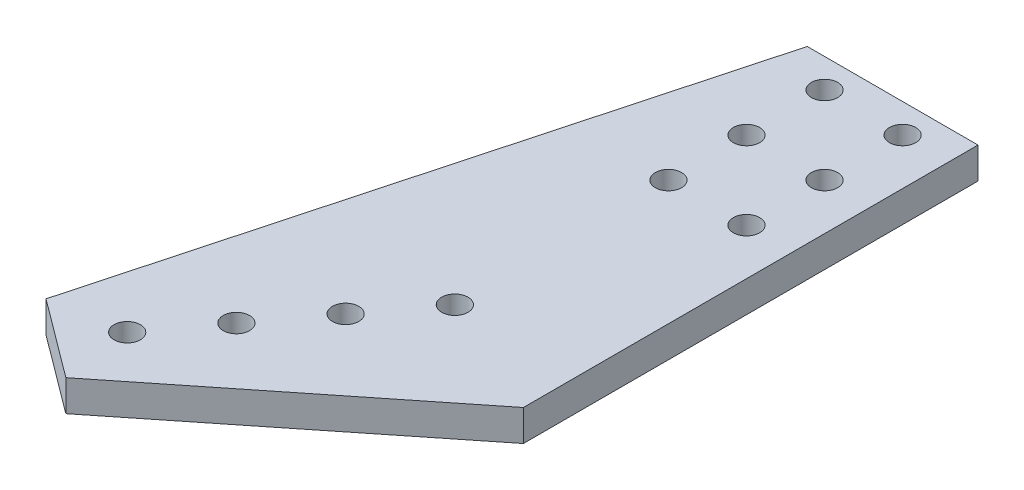
ISO-10303-21;
HEADER;
FILE_DESCRIPTION(('STEP AP214'),'2;1');
FILE_NAME('part.step','',(''),(''),'','','');
FILE_SCHEMA(('AUTOMOTIVE_DESIGN { 1 0 10303 214 1 1 1 1 }'));
ENDSEC;
DATA;
#1=APPLICATION_CONTEXT('core data for automotive mechanical design processes');
#2=APPLICATION_PROTOCOL_DEFINITION('international standard','automotive_design',2000,#1);
#3=PRODUCT_CONTEXT('',#1,'mechanical');
#4=PRODUCT('Part','Part','',(#3));
#5=PRODUCT_RELATED_PRODUCT_CATEGORY('part','',(#4));
#6=PRODUCT_DEFINITION_FORMATION('','',#4);
#7=PRODUCT_DEFINITION_CONTEXT('part definition',#1,'design');
#8=PRODUCT_DEFINITION('design','',#6,#7);
#9=PRODUCT_DEFINITION_SHAPE('','',#8);
#10=(LENGTH_UNIT() NAMED_UNIT(*) SI_UNIT(.MILLI.,.METRE.));
#11=(NAMED_UNIT(*) PLANE_ANGLE_UNIT() SI_UNIT($,.RADIAN.));
#12=(NAMED_UNIT(*) SI_UNIT($,.STERADIAN.) SOLID_ANGLE_UNIT());
#13=UNCERTAINTY_MEASURE_WITH_UNIT(LENGTH_MEASURE(1.E-05),#10,'distance_accuracy_value','');
#14=(GEOMETRIC_REPRESENTATION_CONTEXT(3) GLOBAL_UNCERTAINTY_ASSIGNED_CONTEXT((#13)) GLOBAL_UNIT_ASSIGNED_CONTEXT((#10,
#11,#12)) REPRESENTATION_CONTEXT('',''));
#15=CARTESIAN_POINT('',(0.,0.,0.));
#16=DIRECTION('',(0.,0.,1.));
#17=DIRECTION('',(1.,0.,0.));
#18=AXIS2_PLACEMENT_3D('',#15,#16,#17);
#19=CARTESIAN_POINT('',(-80.153631820855,32.,-59.7946093383578));
#20=DIRECTION('',(0.597946093383578,0.,-0.80153631820855));
#21=DIRECTION('',(-0.80153631820855,0.,-0.597946093383578));
#22=AXIS2_PLACEMENT_3D('',#19,#20,#21);
#23=PLANE('',#22);
#24=DIRECTION('',(0.80153631820855,0.,0.597946093383578));
#25=VECTOR('',#24,1.);
#26=CARTESIAN_POINT('',(-80.153631820855,0.,-59.7946093383578));
#27=LINE('',#26,#25);
#28=CARTESIAN_POINT('',(-80.153631820855,0.,-59.7946093383578));
#29=VERTEX_POINT('',#28);
#30=CARTESIAN_POINT('',(0.,0.,0.));
#31=VERTEX_POINT('',#30);
#32=EDGE_CURVE('E108',#29,#31,#27,.T.);
#33=ORIENTED_EDGE('',*,*,#32,.T.);
#34=DIRECTION('',(0.,-1.,0.));
#35=VECTOR('',#34,1.);
#36=CARTESIAN_POINT('',(0.,32.,0.));
#37=LINE('',#36,#35);
#38=CARTESIAN_POINT('',(0.,32.,0.));
#39=VERTEX_POINT('',#38);
#40=EDGE_CURVE('E11',#39,#31,#37,.T.);
#41=ORIENTED_EDGE('',*,*,#40,.F.);
#42=DIRECTION('',(0.80153631820855,0.,0.597946093383578));
#43=VECTOR('',#42,1.);
#44=CARTESIAN_POINT('',(-80.153631820855,32.,-59.7946093383578));
#45=LINE('',#44,#43);
#46=CARTESIAN_POINT('',(-80.153631820855,32.,-59.7946093383578));
#47=VERTEX_POINT('',#46);
#48=EDGE_CURVE('E117',#47,#39,#45,.T.);
#49=ORIENTED_EDGE('',*,*,#48,.F.);
#50=DIRECTION('',(0.,-1.,0.));
#51=VECTOR('',#50,1.);
#52=CARTESIAN_POINT('',(-80.153631820855,32.,-59.7946093383578));
#53=LINE('',#52,#51);
#54=EDGE_CURVE('E104',#47,#29,#53,.T.);
#55=ORIENTED_EDGE('',*,*,#54,.T.);
#56=EDGE_LOOP('',(#33,#41,#49,#55));
#57=FACE_BOUND('',#56,.T.);
#58=ADVANCED_FACE('F34',(#57),#23,.F.);
#59=CARTESIAN_POINT('',(261.,32.,-208.));
#60=DIRECTION('',(-0.623232338922246,0.,-0.782036732974549));
#61=DIRECTION('',(-0.782036732974549,0.,0.623232338922246));
#62=AXIS2_PLACEMENT_3D('',#59,#60,#61);
#63=PLANE('',#62);
#64=DIRECTION('',(0.782036732974549,0.,-0.623232338922246));
#65=VECTOR('',#64,1.);
#66=CARTESIAN_POINT('',(261.,0.,-208.));
#67=LINE('',#66,#65);
#68=CARTESIAN_POINT('',(261.,0.,-208.));
#69=VERTEX_POINT('',#68);
#70=EDGE_CURVE('E111',#31,#69,#67,.T.);
#71=ORIENTED_EDGE('',*,*,#70,.T.);
#72=DIRECTION('',(0.,-1.,0.));
#73=VECTOR('',#72,1.);
#74=CARTESIAN_POINT('',(261.,32.,-208.));
#75=LINE('',#74,#73);
#76=CARTESIAN_POINT('',(261.,32.,-208.));
#77=VERTEX_POINT('',#76);
#78=EDGE_CURVE('E42',#77,#69,#75,.T.);
#79=ORIENTED_EDGE('',*,*,#78,.F.);
#80=DIRECTION('',(0.782036732974549,0.,-0.623232338922246));
#81=VECTOR('',#80,1.);
#82=CARTESIAN_POINT('',(261.,32.,-208.));
#83=LINE('',#82,#81);
#84=EDGE_CURVE('E84',#39,#77,#83,.T.);
#85=ORIENTED_EDGE('',*,*,#84,.F.);
#86=ORIENTED_EDGE('',*,*,#40,.T.);
#87=EDGE_LOOP('',(#71,#79,#85,#86));
#88=FACE_BOUND('',#87,.T.);
#89=ADVANCED_FACE('F137',(#88),#63,.F.);
#90=CARTESIAN_POINT('',(261.,32.,-674.));
#91=DIRECTION('',(-1.,0.,0.));
#92=DIRECTION('',(0.,0.,1.));
#93=AXIS2_PLACEMENT_3D('',#90,#91,#92);
#94=PLANE('',#93);
#95=DIRECTION('',(0.,0.,-1.));
#96=VECTOR('',#95,1.);
#97=CARTESIAN_POINT('',(261.,0.,-674.));
#98=LINE('',#97,#96);
#99=CARTESIAN_POINT('',(261.,0.,-674.));
#100=VERTEX_POINT('',#99);
#101=EDGE_CURVE('E99',#69,#100,#98,.T.);
#102=ORIENTED_EDGE('',*,*,#101,.T.);
#103=DIRECTION('',(0.,-1.,0.));
#104=VECTOR('',#103,1.);
#105=CARTESIAN_POINT('',(261.,32.,-674.));
#106=LINE('',#105,#104);
#107=CARTESIAN_POINT('',(261.,32.,-674.));
#108=VERTEX_POINT('',#107);
#109=EDGE_CURVE('E96',#108,#100,#106,.T.);
#110=ORIENTED_EDGE('',*,*,#109,.F.);
#111=DIRECTION('',(0.,0.,-1.));
#112=VECTOR('',#111,1.);
#113=CARTESIAN_POINT('',(261.,32.,-674.));
#114=LINE('',#113,#112);
#115=EDGE_CURVE('E88',#77,#108,#114,.T.);
#116=ORIENTED_EDGE('',*,*,#115,.F.);
#117=ORIENTED_EDGE('',*,*,#78,.T.);
#118=EDGE_LOOP('',(#102,#110,#116,#117));
#119=FACE_BOUND('',#118,.T.);
#120=ADVANCED_FACE('F97',(#119),#94,.F.);
#121=CARTESIAN_POINT('',(85.9999999999999,32.,-674.));
#122=DIRECTION('',(0.,0.,1.));
#123=DIRECTION('',(1.,0.,0.));
#124=AXIS2_PLACEMENT_3D('',#121,#122,#123);
#125=PLANE('',#124);
#126=DIRECTION('',(-1.,0.,0.));
#127=VECTOR('',#126,1.);
#128=CARTESIAN_POINT('',(85.9999999999999,0.,-674.));
#129=LINE('',#128,#127);
#130=CARTESIAN_POINT('',(85.9999999999999,0.,-674.));
#131=VERTEX_POINT('',#130);
#132=EDGE_CURVE('E70',#100,#131,#129,.T.);
#133=ORIENTED_EDGE('',*,*,#132,.T.);
#134=DIRECTION('',(0.,-1.,0.));
#135=VECTOR('',#134,1.);
#136=CARTESIAN_POINT('',(85.9999999999999,32.,-674.));
#137=LINE('',#136,#135);
#138=CARTESIAN_POINT('',(85.9999999999999,32.,-674.));
#139=VERTEX_POINT('',#138);
#140=EDGE_CURVE('E100',#139,#131,#137,.T.);
#141=ORIENTED_EDGE('',*,*,#140,.F.);
#142=DIRECTION('',(-1.,0.,0.));
#143=VECTOR('',#142,1.);
#144=CARTESIAN_POINT('',(85.9999999999999,32.,-674.));
#145=LINE('',#144,#143);
#146=EDGE_CURVE('E92',#108,#139,#145,.T.);
#147=ORIENTED_EDGE('',*,*,#146,.F.);
#148=ORIENTED_EDGE('',*,*,#109,.T.);
#149=EDGE_LOOP('',(#133,#141,#147,#148));
#150=FACE_BOUND('',#149,.T.);
#151=ADVANCED_FACE('F102',(#150),#125,.F.);
#152=CARTESIAN_POINT('',(-80.153631820855,32.,-59.7946093383578));
#153=DIRECTION('',(0.965303128958091,0.,0.261131900049992));
#154=DIRECTION('',(0.261131900049992,0.,-0.965303128958091));
#155=AXIS2_PLACEMENT_3D('',#152,#153,#154);
#156=PLANE('',#155);
#157=DIRECTION('',(-0.261131900049991,0.,0.965303128958091));
#158=VECTOR('',#157,1.);
#159=CARTESIAN_POINT('',(-80.153631820855,0.,-59.7946093383578));
#160=LINE('',#159,#158);
#161=EDGE_CURVE('E76',#131,#29,#160,.T.);
#162=ORIENTED_EDGE('',*,*,#161,.T.);
#163=ORIENTED_EDGE('',*,*,#54,.F.);
#164=DIRECTION('',(-0.261131900049991,0.,0.965303128958091));
#165=VECTOR('',#164,1.);
#166=CARTESIAN_POINT('',(-80.153631820855,32.,-59.7946093383578));
#167=LINE('',#166,#165);
#168=EDGE_CURVE('E50',#139,#47,#167,.T.);
#169=ORIENTED_EDGE('',*,*,#168,.F.);
#170=ORIENTED_EDGE('',*,*,#140,.T.);
#171=EDGE_LOOP('',(#162,#163,#169,#170));
#172=FACE_BOUND('',#171,.T.);
#173=ADVANCED_FACE('F125',(#172),#156,.F.);
#174=CARTESIAN_POINT('',(0.,32.,0.));
#175=DIRECTION('',(0.,-1.,0.));
#176=DIRECTION('',(0.,0.,-1.));
#177=AXIS2_PLACEMENT_3D('',#174,#175,#176);
#178=PLANE('',#177);
#179=CARTESIAN_POINT('',(38.9621289886949,32.,-135.847632952185));
#180=DIRECTION('',(0.,1.,0.));
#181=DIRECTION('',(0.,0.,1.));
#182=AXIS2_PLACEMENT_3D('',#179,#180,#181);
#183=CIRCLE('',#182,13.5);
#184=CARTESIAN_POINT('',(38.9621289886949,32.,-122.347632952185));
#185=VERTEX_POINT('',#184);
#186=EDGE_CURVE('E279',#185,#185,#183,.T.);
#187=ORIENTED_EDGE('',*,*,#186,.F.);
#188=EDGE_LOOP('',(#187));
#189=FACE_BOUND('',#188,.T.);
#190=CARTESIAN_POINT('',(86.7978164593811,32.,-199.970538408869));
#191=DIRECTION('',(0.,1.,0.));
#192=DIRECTION('',(0.,0.,1.));
#193=AXIS2_PLACEMENT_3D('',#190,#191,#192);
#194=CIRCLE('',#193,13.5);
#195=CARTESIAN_POINT('',(86.7978164593811,32.,-186.470538408869));
#196=VERTEX_POINT('',#195);
#197=EDGE_CURVE('E281',#196,#196,#194,.T.);
#198=ORIENTED_EDGE('',*,*,#197,.F.);
#199=EDGE_LOOP('',(#198));
#200=FACE_BOUND('',#199,.T.);
#201=CARTESIAN_POINT('',(-8.87355848199136,32.,-71.7247274955008));
#202=DIRECTION('',(0.,1.,0.));
#203=DIRECTION('',(0.,0.,1.));
#204=AXIS2_PLACEMENT_3D('',#201,#202,#203);
#205=CIRCLE('',#204,13.5);
#206=CARTESIAN_POINT('',(-8.87355848199136,32.,-58.2247274955008));
#207=VERTEX_POINT('',#206);
#208=EDGE_CURVE('E287',#207,#207,#205,.T.);
#209=ORIENTED_EDGE('',*,*,#208,.F.);
#210=EDGE_LOOP('',(#209));
#211=FACE_BOUND('',#210,.T.);
#212=CARTESIAN_POINT('',(134.633503930067,32.,-264.093443865553));
#213=DIRECTION('',(0.,1.,0.));
#214=DIRECTION('',(0.,0.,1.));
#215=AXIS2_PLACEMENT_3D('',#212,#213,#214);
#216=CIRCLE('',#215,13.5);
#217=CARTESIAN_POINT('',(134.633503930067,32.,-250.593443865553));
#218=VERTEX_POINT('',#217);
#219=EDGE_CURVE('E293',#218,#218,#216,.T.);
#220=ORIENTED_EDGE('',*,*,#219,.F.);
#221=EDGE_LOOP('',(#220));
#222=FACE_BOUND('',#221,.T.);
#223=CARTESIAN_POINT('',(213.5,32.,-484.193304549108));
#224=DIRECTION('',(0.,1.,0.));
#225=DIRECTION('',(0.,0.,1.));
#226=AXIS2_PLACEMENT_3D('',#223,#224,#225);
#227=CIRCLE('',#226,13.5);
#228=CARTESIAN_POINT('',(213.5,32.,-470.693304549108));
#229=VERTEX_POINT('',#228);
#230=EDGE_CURVE('E299',#229,#229,#227,.T.);
#231=ORIENTED_EDGE('',*,*,#230,.F.);
#232=EDGE_LOOP('',(#231));
#233=FACE_BOUND('',#232,.T.);
#234=CARTESIAN_POINT('',(133.5,32.,-484.193304549108));
#235=DIRECTION('',(0.,1.,0.));
#236=DIRECTION('',(0.,0.,1.));
#237=AXIS2_PLACEMENT_3D('',#234,#235,#236);
#238=CIRCLE('',#237,13.5);
#239=CARTESIAN_POINT('',(133.5,32.,-470.693304549108));
#240=VERTEX_POINT('',#239);
#241=EDGE_CURVE('E305',#240,#240,#238,.T.);
#242=ORIENTED_EDGE('',*,*,#241,.F.);
#243=EDGE_LOOP('',(#242));
#244=FACE_BOUND('',#243,.T.);
#245=CARTESIAN_POINT('',(213.5,32.,-564.193304549108));
#246=DIRECTION('',(0.,1.,0.));
#247=DIRECTION('',(0.,0.,1.));
#248=AXIS2_PLACEMENT_3D('',#245,#246,#247);
#249=CIRCLE('',#248,13.5);
#250=CARTESIAN_POINT('',(213.5,32.,-550.693304549108));
#251=VERTEX_POINT('',#250);
#252=EDGE_CURVE('E311',#251,#251,#249,.T.);
#253=ORIENTED_EDGE('',*,*,#252,.F.);
#254=EDGE_LOOP('',(#253));
#255=FACE_BOUND('',#254,.T.);
#256=CARTESIAN_POINT('',(133.5,32.,-564.193304549108));
#257=DIRECTION('',(0.,1.,0.));
#258=DIRECTION('',(0.,0.,1.));
#259=AXIS2_PLACEMENT_3D('',#256,#257,#258);
#260=CIRCLE('',#259,13.5);
#261=CARTESIAN_POINT('',(133.5,32.,-550.693304549108));
#262=VERTEX_POINT('',#261);
#263=EDGE_CURVE('E317',#262,#262,#260,.T.);
#264=ORIENTED_EDGE('',*,*,#263,.F.);
#265=EDGE_LOOP('',(#264));
#266=FACE_BOUND('',#265,.T.);
#267=CARTESIAN_POINT('',(213.5,32.,-644.193304549108));
#268=DIRECTION('',(0.,1.,0.));
#269=DIRECTION('',(0.,0.,1.));
#270=AXIS2_PLACEMENT_3D('',#267,#268,#269);
#271=CIRCLE('',#270,13.5);
#272=CARTESIAN_POINT('',(213.5,32.,-630.693304549108));
#273=VERTEX_POINT('',#272);
#274=EDGE_CURVE('E323',#273,#273,#271,.T.);
#275=ORIENTED_EDGE('',*,*,#274,.F.);
#276=EDGE_LOOP('',(#275));
#277=FACE_BOUND('',#276,.T.);
#278=CARTESIAN_POINT('',(133.5,32.,-644.193304549108));
#279=DIRECTION('',(0.,1.,0.));
#280=DIRECTION('',(0.,0.,1.));
#281=AXIS2_PLACEMENT_3D('',#278,#279,#280);
#282=CIRCLE('',#281,13.5);
#283=CARTESIAN_POINT('',(133.5,32.,-630.693304549108));
#284=VERTEX_POINT('',#283);
#285=EDGE_CURVE('E329',#284,#284,#282,.T.);
#286=ORIENTED_EDGE('',*,*,#285,.F.);
#287=EDGE_LOOP('',(#286));
#288=FACE_BOUND('',#287,.T.);
#289=ORIENTED_EDGE('',*,*,#48,.T.);
#290=ORIENTED_EDGE('',*,*,#84,.T.);
#291=ORIENTED_EDGE('',*,*,#115,.T.);
#292=ORIENTED_EDGE('',*,*,#146,.T.);
#293=ORIENTED_EDGE('',*,*,#168,.T.);
#294=EDGE_LOOP('',(#289,#290,#291,#292,#293));
#295=FACE_BOUND('',#294,.T.);
#296=ADVANCED_FACE('F90',(#189,#200,#211,#222,#233,#244,#255,#266,#277,#288,#295),#178,.F.);
#297=CARTESIAN_POINT('',(0.,0.,0.));
#298=DIRECTION('',(0.,-1.,0.));
#299=DIRECTION('',(0.,0.,-1.));
#300=AXIS2_PLACEMENT_3D('',#297,#298,#299);
#301=PLANE('',#300);
#302=CARTESIAN_POINT('',(38.9621289886949,0.,-135.847632952185));
#303=DIRECTION('',(0.,1.,0.));
#304=DIRECTION('',(0.,0.,1.));
#305=AXIS2_PLACEMENT_3D('',#302,#303,#304);
#306=CIRCLE('',#305,13.5);
#307=CARTESIAN_POINT('',(38.9621289886949,0.,-122.347632952185));
#308=VERTEX_POINT('',#307);
#309=EDGE_CURVE('E276',#308,#308,#306,.T.);
#310=ORIENTED_EDGE('',*,*,#309,.T.);
#311=EDGE_LOOP('',(#310));
#312=FACE_BOUND('',#311,.T.);
#313=CARTESIAN_POINT('',(86.7978164593811,0.,-199.970538408869));
#314=DIRECTION('',(0.,1.,0.));
#315=DIRECTION('',(0.,0.,1.));
#316=AXIS2_PLACEMENT_3D('',#313,#314,#315);
#317=CIRCLE('',#316,13.5);
#318=CARTESIAN_POINT('',(86.7978164593811,0.,-186.470538408869));
#319=VERTEX_POINT('',#318);
#320=EDGE_CURVE('E284',#319,#319,#317,.T.);
#321=ORIENTED_EDGE('',*,*,#320,.T.);
#322=EDGE_LOOP('',(#321));
#323=FACE_BOUND('',#322,.T.);
#324=CARTESIAN_POINT('',(-8.87355848199136,0.,-71.7247274955008));
#325=DIRECTION('',(0.,1.,0.));
#326=DIRECTION('',(0.,0.,1.));
#327=AXIS2_PLACEMENT_3D('',#324,#325,#326);
#328=CIRCLE('',#327,13.5);
#329=CARTESIAN_POINT('',(-8.87355848199136,0.,-58.2247274955008));
#330=VERTEX_POINT('',#329);
#331=EDGE_CURVE('E290',#330,#330,#328,.T.);
#332=ORIENTED_EDGE('',*,*,#331,.T.);
#333=EDGE_LOOP('',(#332));
#334=FACE_BOUND('',#333,.T.);
#335=CARTESIAN_POINT('',(134.633503930067,0.,-264.093443865553));
#336=DIRECTION('',(0.,1.,0.));
#337=DIRECTION('',(0.,0.,1.));
#338=AXIS2_PLACEMENT_3D('',#335,#336,#337);
#339=CIRCLE('',#338,13.5);
#340=CARTESIAN_POINT('',(134.633503930067,0.,-250.593443865553));
#341=VERTEX_POINT('',#340);
#342=EDGE_CURVE('E296',#341,#341,#339,.T.);
#343=ORIENTED_EDGE('',*,*,#342,.T.);
#344=EDGE_LOOP('',(#343));
#345=FACE_BOUND('',#344,.T.);
#346=CARTESIAN_POINT('',(213.5,0.,-484.193304549108));
#347=DIRECTION('',(0.,1.,0.));
#348=DIRECTION('',(0.,0.,1.));
#349=AXIS2_PLACEMENT_3D('',#346,#347,#348);
#350=CIRCLE('',#349,13.5);
#351=CARTESIAN_POINT('',(213.5,0.,-470.693304549108));
#352=VERTEX_POINT('',#351);
#353=EDGE_CURVE('E302',#352,#352,#350,.T.);
#354=ORIENTED_EDGE('',*,*,#353,.T.);
#355=EDGE_LOOP('',(#354));
#356=FACE_BOUND('',#355,.T.);
#357=CARTESIAN_POINT('',(133.5,0.,-484.193304549108));
#358=DIRECTION('',(0.,1.,0.));
#359=DIRECTION('',(0.,0.,1.));
#360=AXIS2_PLACEMENT_3D('',#357,#358,#359);
#361=CIRCLE('',#360,13.5);
#362=CARTESIAN_POINT('',(133.5,0.,-470.693304549108));
#363=VERTEX_POINT('',#362);
#364=EDGE_CURVE('E308',#363,#363,#361,.T.);
#365=ORIENTED_EDGE('',*,*,#364,.T.);
#366=EDGE_LOOP('',(#365));
#367=FACE_BOUND('',#366,.T.);
#368=CARTESIAN_POINT('',(213.5,0.,-564.193304549108));
#369=DIRECTION('',(0.,1.,0.));
#370=DIRECTION('',(0.,0.,1.));
#371=AXIS2_PLACEMENT_3D('',#368,#369,#370);
#372=CIRCLE('',#371,13.5);
#373=CARTESIAN_POINT('',(213.5,0.,-550.693304549108));
#374=VERTEX_POINT('',#373);
#375=EDGE_CURVE('E314',#374,#374,#372,.T.);
#376=ORIENTED_EDGE('',*,*,#375,.T.);
#377=EDGE_LOOP('',(#376));
#378=FACE_BOUND('',#377,.T.);
#379=CARTESIAN_POINT('',(133.5,0.,-564.193304549108));
#380=DIRECTION('',(0.,1.,0.));
#381=DIRECTION('',(0.,0.,1.));
#382=AXIS2_PLACEMENT_3D('',#379,#380,#381);
#383=CIRCLE('',#382,13.5);
#384=CARTESIAN_POINT('',(133.5,0.,-550.693304549108));
#385=VERTEX_POINT('',#384);
#386=EDGE_CURVE('E320',#385,#385,#383,.T.);
#387=ORIENTED_EDGE('',*,*,#386,.T.);
#388=EDGE_LOOP('',(#387));
#389=FACE_BOUND('',#388,.T.);
#390=CARTESIAN_POINT('',(213.5,0.,-644.193304549108));
#391=DIRECTION('',(0.,1.,0.));
#392=DIRECTION('',(0.,0.,1.));
#393=AXIS2_PLACEMENT_3D('',#390,#391,#392);
#394=CIRCLE('',#393,13.5);
#395=CARTESIAN_POINT('',(213.5,0.,-630.693304549108));
#396=VERTEX_POINT('',#395);
#397=EDGE_CURVE('E326',#396,#396,#394,.T.);
#398=ORIENTED_EDGE('',*,*,#397,.T.);
#399=EDGE_LOOP('',(#398));
#400=FACE_BOUND('',#399,.T.);
#401=CARTESIAN_POINT('',(133.5,0.,-644.193304549108));
#402=DIRECTION('',(0.,1.,0.));
#403=DIRECTION('',(0.,0.,1.));
#404=AXIS2_PLACEMENT_3D('',#401,#402,#403);
#405=CIRCLE('',#404,13.5);
#406=CARTESIAN_POINT('',(133.5,0.,-630.693304549108));
#407=VERTEX_POINT('',#406);
#408=EDGE_CURVE('E112',#407,#407,#405,.T.);
#409=ORIENTED_EDGE('',*,*,#408,.T.);
#410=EDGE_LOOP('',(#409));
#411=FACE_BOUND('',#410,.T.);
#412=ORIENTED_EDGE('',*,*,#32,.F.);
#413=ORIENTED_EDGE('',*,*,#161,.F.);
#414=ORIENTED_EDGE('',*,*,#132,.F.);
#415=ORIENTED_EDGE('',*,*,#101,.F.);
#416=ORIENTED_EDGE('',*,*,#70,.F.);
#417=EDGE_LOOP('',(#412,#413,#414,#415,#416));
#418=FACE_BOUND('',#417,.T.);
#419=ADVANCED_FACE('F121',(#312,#323,#334,#345,#356,#367,#378,#389,#400,#411,#418),#301,.T.);
#420=CARTESIAN_POINT('',(133.5,0.,-644.193304549108));
#421=DIRECTION('',(0.,1.,0.));
#422=DIRECTION('',(0.,0.,1.));
#423=AXIS2_PLACEMENT_3D('',#420,#421,#422);
#424=CYLINDRICAL_SURFACE('',#423,13.5);
#425=ORIENTED_EDGE('',*,*,#408,.F.);
#426=EDGE_LOOP('',(#425));
#427=FACE_BOUND('',#426,.T.);
#428=ORIENTED_EDGE('',*,*,#285,.T.);
#429=EDGE_LOOP('',(#428));
#430=FACE_BOUND('',#429,.T.);
#431=ADVANCED_FACE('F170',(#427,#430),#424,.F.);
#432=CARTESIAN_POINT('',(213.5,0.,-644.193304549108));
#433=DIRECTION('',(0.,1.,0.));
#434=DIRECTION('',(0.,0.,1.));
#435=AXIS2_PLACEMENT_3D('',#432,#433,#434);
#436=CYLINDRICAL_SURFACE('',#435,13.5);
#437=ORIENTED_EDGE('',*,*,#397,.F.);
#438=EDGE_LOOP('',(#437));
#439=FACE_BOUND('',#438,.T.);
#440=ORIENTED_EDGE('',*,*,#274,.T.);
#441=EDGE_LOOP('',(#440));
#442=FACE_BOUND('',#441,.T.);
#443=ADVANCED_FACE('F179',(#439,#442),#436,.F.);
#444=CARTESIAN_POINT('',(133.5,0.,-564.193304549108));
#445=DIRECTION('',(0.,1.,0.));
#446=DIRECTION('',(0.,0.,1.));
#447=AXIS2_PLACEMENT_3D('',#444,#445,#446);
#448=CYLINDRICAL_SURFACE('',#447,13.5);
#449=ORIENTED_EDGE('',*,*,#386,.F.);
#450=EDGE_LOOP('',(#449));
#451=FACE_BOUND('',#450,.T.);
#452=ORIENTED_EDGE('',*,*,#263,.T.);
#453=EDGE_LOOP('',(#452));
#454=FACE_BOUND('',#453,.T.);
#455=ADVANCED_FACE('F189',(#451,#454),#448,.F.);
#456=CARTESIAN_POINT('',(213.5,0.,-564.193304549108));
#457=DIRECTION('',(0.,1.,0.));
#458=DIRECTION('',(0.,0.,1.));
#459=AXIS2_PLACEMENT_3D('',#456,#457,#458);
#460=CYLINDRICAL_SURFACE('',#459,13.5);
#461=ORIENTED_EDGE('',*,*,#375,.F.);
#462=EDGE_LOOP('',(#461));
#463=FACE_BOUND('',#462,.T.);
#464=ORIENTED_EDGE('',*,*,#252,.T.);
#465=EDGE_LOOP('',(#464));
#466=FACE_BOUND('',#465,.T.);
#467=ADVANCED_FACE('F199',(#463,#466),#460,.F.);
#468=CARTESIAN_POINT('',(133.5,0.,-484.193304549108));
#469=DIRECTION('',(0.,1.,0.));
#470=DIRECTION('',(0.,0.,1.));
#471=AXIS2_PLACEMENT_3D('',#468,#469,#470);
#472=CYLINDRICAL_SURFACE('',#471,13.5);
#473=ORIENTED_EDGE('',*,*,#364,.F.);
#474=EDGE_LOOP('',(#473));
#475=FACE_BOUND('',#474,.T.);
#476=ORIENTED_EDGE('',*,*,#241,.T.);
#477=EDGE_LOOP('',(#476));
#478=FACE_BOUND('',#477,.T.);
#479=ADVANCED_FACE('F209',(#475,#478),#472,.F.);
#480=CARTESIAN_POINT('',(213.5,0.,-484.193304549108));
#481=DIRECTION('',(0.,1.,0.));
#482=DIRECTION('',(0.,0.,1.));
#483=AXIS2_PLACEMENT_3D('',#480,#481,#482);
#484=CYLINDRICAL_SURFACE('',#483,13.5);
#485=ORIENTED_EDGE('',*,*,#353,.F.);
#486=EDGE_LOOP('',(#485));
#487=FACE_BOUND('',#486,.T.);
#488=ORIENTED_EDGE('',*,*,#230,.T.);
#489=EDGE_LOOP('',(#488));
#490=FACE_BOUND('',#489,.T.);
#491=ADVANCED_FACE('F219',(#487,#490),#484,.F.);
#492=CARTESIAN_POINT('',(134.633503930067,0.,-264.093443865553));
#493=DIRECTION('',(0.,1.,0.));
#494=DIRECTION('',(0.,0.,1.));
#495=AXIS2_PLACEMENT_3D('',#492,#493,#494);
#496=CYLINDRICAL_SURFACE('',#495,13.5);
#497=ORIENTED_EDGE('',*,*,#342,.F.);
#498=EDGE_LOOP('',(#497));
#499=FACE_BOUND('',#498,.T.);
#500=ORIENTED_EDGE('',*,*,#219,.T.);
#501=EDGE_LOOP('',(#500));
#502=FACE_BOUND('',#501,.T.);
#503=ADVANCED_FACE('F229',(#499,#502),#496,.F.);
#504=CARTESIAN_POINT('',(-8.87355848199136,0.,-71.7247274955008));
#505=DIRECTION('',(0.,1.,0.));
#506=DIRECTION('',(0.,0.,1.));
#507=AXIS2_PLACEMENT_3D('',#504,#505,#506);
#508=CYLINDRICAL_SURFACE('',#507,13.5);
#509=ORIENTED_EDGE('',*,*,#331,.F.);
#510=EDGE_LOOP('',(#509));
#511=FACE_BOUND('',#510,.T.);
#512=ORIENTED_EDGE('',*,*,#208,.T.);
#513=EDGE_LOOP('',(#512));
#514=FACE_BOUND('',#513,.T.);
#515=ADVANCED_FACE('F239',(#511,#514),#508,.F.);
#516=CARTESIAN_POINT('',(86.7978164593811,0.,-199.970538408869));
#517=DIRECTION('',(0.,1.,0.));
#518=DIRECTION('',(0.,0.,1.));
#519=AXIS2_PLACEMENT_3D('',#516,#517,#518);
#520=CYLINDRICAL_SURFACE('',#519,13.5);
#521=ORIENTED_EDGE('',*,*,#320,.F.);
#522=EDGE_LOOP('',(#521));
#523=FACE_BOUND('',#522,.T.);
#524=ORIENTED_EDGE('',*,*,#197,.T.);
#525=EDGE_LOOP('',(#524));
#526=FACE_BOUND('',#525,.T.);
#527=ADVANCED_FACE('F249',(#523,#526),#520,.F.);
#528=CARTESIAN_POINT('',(38.9621289886949,0.,-135.847632952185));
#529=DIRECTION('',(0.,1.,0.));
#530=DIRECTION('',(0.,0.,1.));
#531=AXIS2_PLACEMENT_3D('',#528,#529,#530);
#532=CYLINDRICAL_SURFACE('',#531,13.5);
#533=ORIENTED_EDGE('',*,*,#309,.F.);
#534=EDGE_LOOP('',(#533));
#535=FACE_BOUND('',#534,.T.);
#536=ORIENTED_EDGE('',*,*,#186,.T.);
#537=EDGE_LOOP('',(#536));
#538=FACE_BOUND('',#537,.T.);
#539=ADVANCED_FACE('F259',(#535,#538),#532,.F.);
#540=CLOSED_SHELL('',(#58,#89,#120,#151,#173,#296,#419,#431,#443,#455,#467,#479,#491,#503,#515,
#527,#539));
#541=MANIFOLD_SOLID_BREP('B2',#540);
#542=ADVANCED_BREP_SHAPE_REPRESENTATION('',(#18,#541),#14);
#543=SHAPE_DEFINITION_REPRESENTATION(#9,#542);
ENDSEC;
END-ISO-10303-21;
